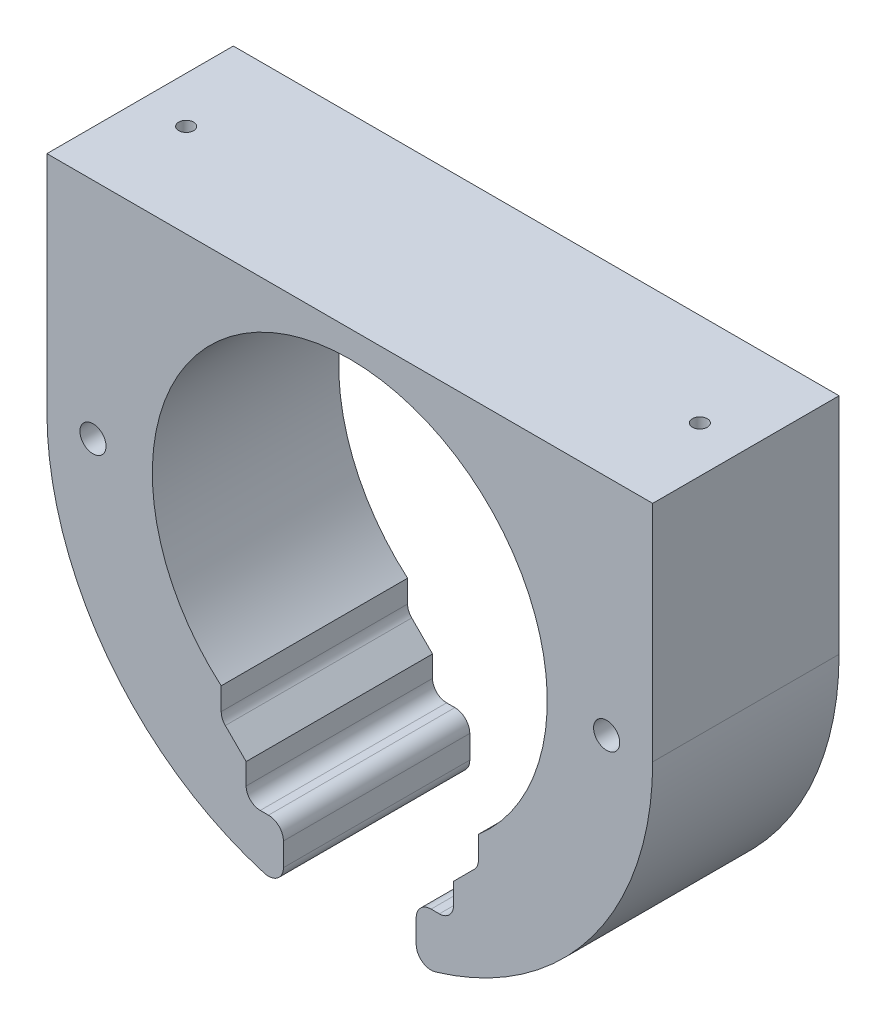
ISO-10303-21;
HEADER;
FILE_DESCRIPTION(('STEP AP214'),'2;1');
FILE_NAME('part.step','',(''),(''),'','','');
FILE_SCHEMA(('AUTOMOTIVE_DESIGN { 1 0 10303 214 1 1 1 1 }'));
ENDSEC;
DATA;
#1=APPLICATION_CONTEXT('core data for automotive mechanical design processes');
#2=APPLICATION_PROTOCOL_DEFINITION('international standard','automotive_design',2000,#1);
#3=PRODUCT_CONTEXT('',#1,'mechanical');
#4=PRODUCT('Part','Part','',(#3));
#5=PRODUCT_RELATED_PRODUCT_CATEGORY('part','',(#4));
#6=PRODUCT_DEFINITION_FORMATION('','',#4);
#7=PRODUCT_DEFINITION_CONTEXT('part definition',#1,'design');
#8=PRODUCT_DEFINITION('design','',#6,#7);
#9=PRODUCT_DEFINITION_SHAPE('','',#8);
#10=(LENGTH_UNIT() NAMED_UNIT(*) SI_UNIT(.MILLI.,.METRE.));
#11=(NAMED_UNIT(*) PLANE_ANGLE_UNIT() SI_UNIT($,.RADIAN.));
#12=(NAMED_UNIT(*) SI_UNIT($,.STERADIAN.) SOLID_ANGLE_UNIT());
#13=UNCERTAINTY_MEASURE_WITH_UNIT(LENGTH_MEASURE(1.E-05),#10,'distance_accuracy_value','');
#14=(GEOMETRIC_REPRESENTATION_CONTEXT(3) GLOBAL_UNCERTAINTY_ASSIGNED_CONTEXT((#13)) GLOBAL_UNIT_ASSIGNED_CONTEXT((#10,
#11,#12)) REPRESENTATION_CONTEXT('',''));
#15=CARTESIAN_POINT('',(0.,0.,0.));
#16=DIRECTION('',(0.,0.,1.));
#17=DIRECTION('',(1.,0.,0.));
#18=AXIS2_PLACEMENT_3D('',#15,#16,#17);
#19=CARTESIAN_POINT('',(7.80176695441169,-19.422942901138,12.7));
#20=DIRECTION('',(0.,0.,1.));
#21=DIRECTION('',(1.,0.,0.));
#22=AXIS2_PLACEMENT_3D('',#19,#20,#21);
#23=PLANE('',#22);
#24=CARTESIAN_POINT('',(-17.5,-7.68858431104459,12.7));
#25=DIRECTION('',(0.,0.,1.));
#26=DIRECTION('',(1.,0.,0.));
#27=AXIS2_PLACEMENT_3D('',#24,#25,#26);
#28=CIRCLE('',#27,0.889);
#29=CARTESIAN_POINT('',(-16.611,-7.68858431104459,12.7));
#30=VERTEX_POINT('',#29);
#31=EDGE_CURVE('E229',#30,#30,#28,.T.);
#32=ORIENTED_EDGE('',*,*,#31,.F.);
#33=EDGE_LOOP('',(#32));
#34=FACE_BOUND('',#33,.T.);
#35=CARTESIAN_POINT('',(7.80176695441169,-19.422942901138,12.7));
#36=DIRECTION('',(0.,0.,-1.));
#37=DIRECTION('',(1.,0.,0.));
#38=AXIS2_PLACEMENT_3D('',#35,#36,#37);
#39=CIRCLE('',#38,0.961073038880573);
#40=CARTESIAN_POINT('',(8.76283999329226,-19.4229429011379,12.7));
#41=VERTEX_POINT('',#40);
#42=CARTESIAN_POINT('',(8.4813482174197,-20.102524164146,12.7));
#43=VERTEX_POINT('',#42);
#44=EDGE_CURVE('E272',#41,#43,#39,.T.);
#45=ORIENTED_EDGE('',*,*,#44,.T.);
#46=DIRECTION('',(-0.707106781186548,-0.707106781186547,0.));
#47=VECTOR('',#46,1.);
#48=CARTESIAN_POINT('',(7.06388683577223,-21.5199855457934,12.7));
#49=LINE('',#48,#47);
#50=CARTESIAN_POINT('',(7.06388683577223,-21.5199855457934,12.7));
#51=VERTEX_POINT('',#50);
#52=EDGE_CURVE('E139',#43,#51,#49,.T.);
#53=ORIENTED_EDGE('',*,*,#52,.T.);
#54=DIRECTION('',(0.,-1.,0.));
#55=VECTOR('',#54,1.);
#56=CARTESIAN_POINT('',(7.06388683577223,-22.9615951041143,12.7));
#57=LINE('',#56,#55);
#58=CARTESIAN_POINT('',(7.06388683577223,-22.9615951041143,12.7));
#59=VERTEX_POINT('',#58);
#60=EDGE_CURVE('E335',#51,#59,#57,.T.);
#61=ORIENTED_EDGE('',*,*,#60,.T.);
#62=CARTESIAN_POINT('',(6.10281379689165,-22.9615951041143,12.7));
#63=DIRECTION('',(0.,0.,-1.));
#64=DIRECTION('',(1.,0.,0.));
#65=AXIS2_PLACEMENT_3D('',#62,#63,#64);
#66=CIRCLE('',#65,0.961073038880575);
#67=CARTESIAN_POINT('',(6.10281379689165,-23.9226681429949,12.7));
#68=VERTEX_POINT('',#67);
#69=EDGE_CURVE('E354',#59,#68,#66,.T.);
#70=ORIENTED_EDGE('',*,*,#69,.T.);
#71=DIRECTION('',(-1.,0.,0.));
#72=VECTOR('',#71,1.);
#73=CARTESIAN_POINT('',(5.53988683577223,-23.9226681429949,12.7));
#74=LINE('',#73,#72);
#75=CARTESIAN_POINT('',(5.53988683577223,-23.9226681429949,12.7));
#76=VERTEX_POINT('',#75);
#77=EDGE_CURVE('E351',#68,#76,#74,.T.);
#78=ORIENTED_EDGE('',*,*,#77,.T.);
#79=CARTESIAN_POINT('',(5.53988683577223,-24.9386681429949,12.7));
#80=DIRECTION('',(0.,0.,1.));
#81=DIRECTION('',(1.,0.,0.));
#82=AXIS2_PLACEMENT_3D('',#79,#80,#81);
#83=CIRCLE('',#82,1.016);
#84=CARTESIAN_POINT('',(4.52388683577223,-24.9386681429949,12.7));
#85=VERTEX_POINT('',#84);
#86=EDGE_CURVE('E353',#76,#85,#83,.T.);
#87=ORIENTED_EDGE('',*,*,#86,.T.);
#88=DIRECTION('',(0.,-1.,0.));
#89=VECTOR('',#88,1.);
#90=CARTESIAN_POINT('',(4.52388683577223,-26.5117858478937,12.7));
#91=LINE('',#90,#89);
#92=CARTESIAN_POINT('',(4.52388683577223,-26.5117858478937,12.7));
#93=VERTEX_POINT('',#92);
#94=EDGE_CURVE('E356',#85,#93,#91,.T.);
#95=ORIENTED_EDGE('',*,*,#94,.T.);
#96=CARTESIAN_POINT('',(5.53988683577223,-26.5117858478937,12.7));
#97=DIRECTION('',(0.,0.,1.));
#98=DIRECTION('',(-1.,0.,0.));
#99=AXIS2_PLACEMENT_3D('',#96,#97,#98);
#100=CIRCLE('',#99,1.016);
#101=CARTESIAN_POINT('',(5.82674181755978,-27.4864500051415,12.7));
#102=VERTEX_POINT('',#101);
#103=EDGE_CURVE('E362',#93,#102,#100,.T.);
#104=ORIENTED_EDGE('',*,*,#103,.T.);
#105=CARTESIAN_POINT('',(0.,-7.68858431104459,12.7));
#106=DIRECTION('',(0.,0.,1.));
#107=DIRECTION('',(1.,0.,0.));
#108=AXIS2_PLACEMENT_3D('',#105,#106,#107);
#109=CIRCLE('',#108,20.6375);
#110=CARTESIAN_POINT('',(20.6375,-7.68858431104459,12.7));
#111=VERTEX_POINT('',#110);
#112=EDGE_CURVE('E364',#102,#111,#109,.T.);
#113=ORIENTED_EDGE('',*,*,#112,.T.);
#114=DIRECTION('',(0.,1.,0.));
#115=VECTOR('',#114,1.);
#116=CARTESIAN_POINT('',(20.6375,7.5672668129554,12.7));
#117=LINE('',#116,#115);
#118=CARTESIAN_POINT('',(20.6375,7.5672668129554,12.7));
#119=VERTEX_POINT('',#118);
#120=EDGE_CURVE('E366',#111,#119,#117,.T.);
#121=ORIENTED_EDGE('',*,*,#120,.T.);
#122=DIRECTION('',(-1.,0.,0.));
#123=VECTOR('',#122,1.);
#124=CARTESIAN_POINT('',(-20.6375,7.5672668129554,12.7));
#125=LINE('',#124,#123);
#126=CARTESIAN_POINT('',(-20.6375,7.5672668129554,12.7));
#127=VERTEX_POINT('',#126);
#128=EDGE_CURVE('E368',#119,#127,#125,.T.);
#129=ORIENTED_EDGE('',*,*,#128,.T.);
#130=DIRECTION('',(0.,-1.,0.));
#131=VECTOR('',#130,1.);
#132=CARTESIAN_POINT('',(-20.6375,-7.68858431104459,12.7));
#133=LINE('',#132,#131);
#134=CARTESIAN_POINT('',(-20.6375,-7.68858431104459,12.7));
#135=VERTEX_POINT('',#134);
#136=EDGE_CURVE('E370',#127,#135,#133,.T.);
#137=ORIENTED_EDGE('',*,*,#136,.T.);
#138=CARTESIAN_POINT('',(0.,-7.68858431104459,12.7));
#139=DIRECTION('',(0.,0.,1.));
#140=DIRECTION('',(1.,0.,0.));
#141=AXIS2_PLACEMENT_3D('',#138,#139,#140);
#142=CIRCLE('',#141,20.6375);
#143=CARTESIAN_POINT('',(-5.82674181755977,-27.4864500051415,12.7));
#144=VERTEX_POINT('',#143);
#145=EDGE_CURVE('E372',#135,#144,#142,.T.);
#146=ORIENTED_EDGE('',*,*,#145,.T.);
#147=CARTESIAN_POINT('',(-5.53988683577221,-26.5117858478937,12.7));
#148=DIRECTION('',(0.,0.,1.));
#149=DIRECTION('',(1.,0.,0.));
#150=AXIS2_PLACEMENT_3D('',#147,#148,#149);
#151=CIRCLE('',#150,1.016);
#152=CARTESIAN_POINT('',(-4.52388683577221,-26.5117858478937,12.7));
#153=VERTEX_POINT('',#152);
#154=EDGE_CURVE('E374',#144,#153,#151,.T.);
#155=ORIENTED_EDGE('',*,*,#154,.T.);
#156=DIRECTION('',(0.,1.,0.));
#157=VECTOR('',#156,1.);
#158=CARTESIAN_POINT('',(-4.52388683577221,-24.9386681429949,12.7));
#159=LINE('',#158,#157);
#160=CARTESIAN_POINT('',(-4.52388683577221,-24.9386681429949,12.7));
#161=VERTEX_POINT('',#160);
#162=EDGE_CURVE('E376',#153,#161,#159,.T.);
#163=ORIENTED_EDGE('',*,*,#162,.T.);
#164=CARTESIAN_POINT('',(-5.53988683577221,-24.9386681429949,12.7));
#165=DIRECTION('',(0.,0.,1.));
#166=DIRECTION('',(-1.,0.,0.));
#167=AXIS2_PLACEMENT_3D('',#164,#165,#166);
#168=CIRCLE('',#167,1.016);
#169=CARTESIAN_POINT('',(-5.53988683577222,-23.9226681429949,12.7));
#170=VERTEX_POINT('',#169);
#171=EDGE_CURVE('E378',#161,#170,#168,.T.);
#172=ORIENTED_EDGE('',*,*,#171,.T.);
#173=DIRECTION('',(-1.,0.,0.));
#174=VECTOR('',#173,1.);
#175=CARTESIAN_POINT('',(-6.10281379689163,-23.9226681429949,12.7));
#176=LINE('',#175,#174);
#177=CARTESIAN_POINT('',(-6.10281379689163,-23.9226681429949,12.7));
#178=VERTEX_POINT('',#177);
#179=EDGE_CURVE('E380',#170,#178,#176,.T.);
#180=ORIENTED_EDGE('',*,*,#179,.T.);
#181=CARTESIAN_POINT('',(-6.10281379689164,-22.9615951041143,12.7));
#182=DIRECTION('',(0.,0.,-1.));
#183=DIRECTION('',(1.,0.,0.));
#184=AXIS2_PLACEMENT_3D('',#181,#182,#183);
#185=CIRCLE('',#184,0.961073038880575);
#186=CARTESIAN_POINT('',(-7.06388683577221,-22.9615951041143,12.7));
#187=VERTEX_POINT('',#186);
#188=EDGE_CURVE('E382',#178,#187,#185,.T.);
#189=ORIENTED_EDGE('',*,*,#188,.T.);
#190=DIRECTION('',(0.,1.,0.));
#191=VECTOR('',#190,1.);
#192=CARTESIAN_POINT('',(-7.06388683577221,-21.5199855457934,12.7));
#193=LINE('',#192,#191);
#194=CARTESIAN_POINT('',(-7.06388683577221,-21.5199855457934,12.7));
#195=VERTEX_POINT('',#194);
#196=EDGE_CURVE('E384',#187,#195,#193,.T.);
#197=ORIENTED_EDGE('',*,*,#196,.T.);
#198=DIRECTION('',(-0.707106781186549,0.707106781186546,0.));
#199=VECTOR('',#198,1.);
#200=CARTESIAN_POINT('',(-8.48134821741969,-20.102524164146,12.7));
#201=LINE('',#200,#199);
#202=CARTESIAN_POINT('',(-8.48134821741969,-20.102524164146,12.7));
#203=VERTEX_POINT('',#202);
#204=EDGE_CURVE('E386',#195,#203,#201,.T.);
#205=ORIENTED_EDGE('',*,*,#204,.T.);
#206=CARTESIAN_POINT('',(-7.80176695441168,-19.422942901138,12.7));
#207=DIRECTION('',(0.,0.,-1.));
#208=DIRECTION('',(1.,0.,0.));
#209=AXIS2_PLACEMENT_3D('',#206,#207,#208);
#210=CIRCLE('',#209,0.961073038880575);
#211=CARTESIAN_POINT('',(-8.76283999329225,-19.422942901138,12.7));
#212=VERTEX_POINT('',#211);
#213=EDGE_CURVE('E206',#203,#212,#210,.T.);
#214=ORIENTED_EDGE('',*,*,#213,.T.);
#215=DIRECTION('',(0.,1.,0.));
#216=VECTOR('',#215,1.);
#217=CARTESIAN_POINT('',(-8.76283999329225,-17.8988863105123,12.7));
#218=LINE('',#217,#216);
#219=CARTESIAN_POINT('',(-8.76283999329225,-17.8988863105123,12.7));
#220=VERTEX_POINT('',#219);
#221=EDGE_CURVE('E200',#212,#220,#218,.T.);
#222=ORIENTED_EDGE('',*,*,#221,.T.);
#223=CARTESIAN_POINT('',(0.,-7.68858431104459,12.7));
#224=DIRECTION('',(0.,0.,-1.));
#225=DIRECTION('',(1.,0.,0.));
#226=AXIS2_PLACEMENT_3D('',#223,#224,#225);
#227=CIRCLE('',#226,13.455022544328);
#228=CARTESIAN_POINT('',(8.76283999329226,-17.8988863105123,12.7));
#229=VERTEX_POINT('',#228);
#230=EDGE_CURVE('E204',#220,#229,#227,.T.);
#231=ORIENTED_EDGE('',*,*,#230,.T.);
#232=DIRECTION('',(0.,-1.,0.));
#233=VECTOR('',#232,1.);
#234=CARTESIAN_POINT('',(8.76283999329226,-19.4229429011379,12.7));
#235=LINE('',#234,#233);
#236=EDGE_CURVE('E49',#229,#41,#235,.T.);
#237=ORIENTED_EDGE('',*,*,#236,.T.);
#238=EDGE_LOOP('',(#45,#53,#61,#70,#78,#87,#95,#104,#113,#121,#129,#137,#146,#155,#163,#172,
#180,#189,#197,#205,#214,#222,#231,#237));
#239=FACE_BOUND('',#238,.T.);
#240=CARTESIAN_POINT('',(17.5,-7.68858431104459,12.7));
#241=DIRECTION('',(0.,0.,1.));
#242=DIRECTION('',(1.,0.,0.));
#243=AXIS2_PLACEMENT_3D('',#240,#241,#242);
#244=CIRCLE('',#243,0.889);
#245=CARTESIAN_POINT('',(18.389,-7.68858431104459,12.7));
#246=VERTEX_POINT('',#245);
#247=EDGE_CURVE('E457',#246,#246,#244,.T.);
#248=ORIENTED_EDGE('',*,*,#247,.F.);
#249=EDGE_LOOP('',(#248));
#250=FACE_BOUND('',#249,.T.);
#251=ADVANCED_FACE('F32',(#34,#239,#250),#23,.T.);
#252=CARTESIAN_POINT('',(7.80176695441169,-19.422942901138,0.));
#253=DIRECTION('',(0.,0.,1.));
#254=DIRECTION('',(1.,0.,0.));
#255=AXIS2_PLACEMENT_3D('',#252,#253,#254);
#256=PLANE('',#255);
#257=CARTESIAN_POINT('',(-17.5,-7.68858431104459,0.));
#258=DIRECTION('',(0.,0.,1.));
#259=DIRECTION('',(1.,0.,0.));
#260=AXIS2_PLACEMENT_3D('',#257,#258,#259);
#261=CIRCLE('',#260,0.889);
#262=CARTESIAN_POINT('',(-16.611,-7.68858431104459,0.));
#263=VERTEX_POINT('',#262);
#264=EDGE_CURVE('E460',#263,#263,#261,.T.);
#265=ORIENTED_EDGE('',*,*,#264,.T.);
#266=EDGE_LOOP('',(#265));
#267=FACE_BOUND('',#266,.T.);
#268=CARTESIAN_POINT('',(7.80176695441169,-19.422942901138,0.));
#269=DIRECTION('',(0.,0.,-1.));
#270=DIRECTION('',(1.,0.,0.));
#271=AXIS2_PLACEMENT_3D('',#268,#269,#270);
#272=CIRCLE('',#271,0.961073038880573);
#273=CARTESIAN_POINT('',(8.76283999329226,-19.4229429011379,0.));
#274=VERTEX_POINT('',#273);
#275=CARTESIAN_POINT('',(8.4813482174197,-20.102524164146,0.));
#276=VERTEX_POINT('',#275);
#277=EDGE_CURVE('E225',#274,#276,#272,.T.);
#278=ORIENTED_EDGE('',*,*,#277,.F.);
#279=DIRECTION('',(0.,-1.,0.));
#280=VECTOR('',#279,1.);
#281=CARTESIAN_POINT('',(8.76283999329226,-19.4229429011379,0.));
#282=LINE('',#281,#280);
#283=CARTESIAN_POINT('',(8.76283999329226,-17.8988863105123,0.));
#284=VERTEX_POINT('',#283);
#285=EDGE_CURVE('E131',#284,#274,#282,.T.);
#286=ORIENTED_EDGE('',*,*,#285,.F.);
#287=CARTESIAN_POINT('',(0.,-7.68858431104459,0.));
#288=DIRECTION('',(0.,0.,-1.));
#289=DIRECTION('',(1.,0.,0.));
#290=AXIS2_PLACEMENT_3D('',#287,#288,#289);
#291=CIRCLE('',#290,13.455022544328);
#292=CARTESIAN_POINT('',(-8.76283999329225,-17.8988863105123,0.));
#293=VERTEX_POINT('',#292);
#294=EDGE_CURVE('E125',#293,#284,#291,.T.);
#295=ORIENTED_EDGE('',*,*,#294,.F.);
#296=DIRECTION('',(0.,1.,0.));
#297=VECTOR('',#296,1.);
#298=CARTESIAN_POINT('',(-8.76283999329225,-17.8988863105123,0.));
#299=LINE('',#298,#297);
#300=CARTESIAN_POINT('',(-8.76283999329225,-19.422942901138,0.));
#301=VERTEX_POINT('',#300);
#302=EDGE_CURVE('E215',#301,#293,#299,.T.);
#303=ORIENTED_EDGE('',*,*,#302,.F.);
#304=CARTESIAN_POINT('',(-7.80176695441168,-19.422942901138,0.));
#305=DIRECTION('',(0.,0.,-1.));
#306=DIRECTION('',(1.,0.,0.));
#307=AXIS2_PLACEMENT_3D('',#304,#305,#306);
#308=CIRCLE('',#307,0.961073038880575);
#309=CARTESIAN_POINT('',(-8.48134821741969,-20.102524164146,0.));
#310=VERTEX_POINT('',#309);
#311=EDGE_CURVE('E267',#310,#301,#308,.T.);
#312=ORIENTED_EDGE('',*,*,#311,.F.);
#313=DIRECTION('',(-0.707106781186549,0.707106781186546,0.));
#314=VECTOR('',#313,1.);
#315=CARTESIAN_POINT('',(-8.48134821741969,-20.102524164146,0.));
#316=LINE('',#315,#314);
#317=CARTESIAN_POINT('',(-7.06388683577221,-21.5199855457934,0.));
#318=VERTEX_POINT('',#317);
#319=EDGE_CURVE('E265',#318,#310,#316,.T.);
#320=ORIENTED_EDGE('',*,*,#319,.F.);
#321=DIRECTION('',(0.,1.,0.));
#322=VECTOR('',#321,1.);
#323=CARTESIAN_POINT('',(-7.06388683577221,-21.5199855457934,0.));
#324=LINE('',#323,#322);
#325=CARTESIAN_POINT('',(-7.06388683577221,-22.9615951041143,0.));
#326=VERTEX_POINT('',#325);
#327=EDGE_CURVE('E263',#326,#318,#324,.T.);
#328=ORIENTED_EDGE('',*,*,#327,.F.);
#329=CARTESIAN_POINT('',(-6.10281379689164,-22.9615951041143,0.));
#330=DIRECTION('',(0.,0.,-1.));
#331=DIRECTION('',(1.,0.,0.));
#332=AXIS2_PLACEMENT_3D('',#329,#330,#331);
#333=CIRCLE('',#332,0.961073038880575);
#334=CARTESIAN_POINT('',(-6.10281379689163,-23.9226681429949,0.));
#335=VERTEX_POINT('',#334);
#336=EDGE_CURVE('E261',#335,#326,#333,.T.);
#337=ORIENTED_EDGE('',*,*,#336,.F.);
#338=DIRECTION('',(-1.,0.,0.));
#339=VECTOR('',#338,1.);
#340=CARTESIAN_POINT('',(-6.10281379689163,-23.9226681429949,0.));
#341=LINE('',#340,#339);
#342=CARTESIAN_POINT('',(-5.53988683577222,-23.9226681429949,0.));
#343=VERTEX_POINT('',#342);
#344=EDGE_CURVE('E259',#343,#335,#341,.T.);
#345=ORIENTED_EDGE('',*,*,#344,.F.);
#346=CARTESIAN_POINT('',(-5.53988683577221,-24.9386681429949,0.));
#347=DIRECTION('',(0.,0.,1.));
#348=DIRECTION('',(-1.,0.,0.));
#349=AXIS2_PLACEMENT_3D('',#346,#347,#348);
#350=CIRCLE('',#349,1.016);
#351=CARTESIAN_POINT('',(-4.52388683577221,-24.9386681429949,0.));
#352=VERTEX_POINT('',#351);
#353=EDGE_CURVE('E257',#352,#343,#350,.T.);
#354=ORIENTED_EDGE('',*,*,#353,.F.);
#355=DIRECTION('',(0.,1.,0.));
#356=VECTOR('',#355,1.);
#357=CARTESIAN_POINT('',(-4.52388683577221,-24.9386681429949,0.));
#358=LINE('',#357,#356);
#359=CARTESIAN_POINT('',(-4.52388683577221,-26.5117858478937,0.));
#360=VERTEX_POINT('',#359);
#361=EDGE_CURVE('E255',#360,#352,#358,.T.);
#362=ORIENTED_EDGE('',*,*,#361,.F.);
#363=CARTESIAN_POINT('',(-5.53988683577221,-26.5117858478937,0.));
#364=DIRECTION('',(0.,0.,1.));
#365=DIRECTION('',(1.,0.,0.));
#366=AXIS2_PLACEMENT_3D('',#363,#364,#365);
#367=CIRCLE('',#366,1.016);
#368=CARTESIAN_POINT('',(-5.82674181755977,-27.4864500051415,0.));
#369=VERTEX_POINT('',#368);
#370=EDGE_CURVE('E253',#369,#360,#367,.T.);
#371=ORIENTED_EDGE('',*,*,#370,.F.);
#372=CARTESIAN_POINT('',(0.,-7.68858431104459,0.));
#373=DIRECTION('',(0.,0.,1.));
#374=DIRECTION('',(1.,0.,0.));
#375=AXIS2_PLACEMENT_3D('',#372,#373,#374);
#376=CIRCLE('',#375,20.6375);
#377=CARTESIAN_POINT('',(-20.6375,-7.68858431104459,0.));
#378=VERTEX_POINT('',#377);
#379=EDGE_CURVE('E251',#378,#369,#376,.T.);
#380=ORIENTED_EDGE('',*,*,#379,.F.);
#381=DIRECTION('',(0.,-1.,0.));
#382=VECTOR('',#381,1.);
#383=CARTESIAN_POINT('',(-20.6375,-7.68858431104459,0.));
#384=LINE('',#383,#382);
#385=CARTESIAN_POINT('',(-20.6375,7.5672668129554,0.));
#386=VERTEX_POINT('',#385);
#387=EDGE_CURVE('E249',#386,#378,#384,.T.);
#388=ORIENTED_EDGE('',*,*,#387,.F.);
#389=DIRECTION('',(-1.,0.,0.));
#390=VECTOR('',#389,1.);
#391=CARTESIAN_POINT('',(-20.6375,7.5672668129554,0.));
#392=LINE('',#391,#390);
#393=CARTESIAN_POINT('',(20.6375,7.5672668129554,0.));
#394=VERTEX_POINT('',#393);
#395=EDGE_CURVE('E247',#394,#386,#392,.T.);
#396=ORIENTED_EDGE('',*,*,#395,.F.);
#397=DIRECTION('',(0.,1.,0.));
#398=VECTOR('',#397,1.);
#399=CARTESIAN_POINT('',(20.6375,7.5672668129554,0.));
#400=LINE('',#399,#398);
#401=CARTESIAN_POINT('',(20.6375,-7.68858431104459,0.));
#402=VERTEX_POINT('',#401);
#403=EDGE_CURVE('E245',#402,#394,#400,.T.);
#404=ORIENTED_EDGE('',*,*,#403,.F.);
#405=CARTESIAN_POINT('',(0.,-7.68858431104459,0.));
#406=DIRECTION('',(0.,0.,1.));
#407=DIRECTION('',(1.,0.,0.));
#408=AXIS2_PLACEMENT_3D('',#405,#406,#407);
#409=CIRCLE('',#408,20.6375);
#410=CARTESIAN_POINT('',(5.82674181755978,-27.4864500051415,0.));
#411=VERTEX_POINT('',#410);
#412=EDGE_CURVE('E243',#411,#402,#409,.T.);
#413=ORIENTED_EDGE('',*,*,#412,.F.);
#414=CARTESIAN_POINT('',(5.53988683577223,-26.5117858478937,0.));
#415=DIRECTION('',(0.,0.,1.));
#416=DIRECTION('',(-1.,0.,0.));
#417=AXIS2_PLACEMENT_3D('',#414,#415,#416);
#418=CIRCLE('',#417,1.016);
#419=CARTESIAN_POINT('',(4.52388683577223,-26.5117858478937,0.));
#420=VERTEX_POINT('',#419);
#421=EDGE_CURVE('E241',#420,#411,#418,.T.);
#422=ORIENTED_EDGE('',*,*,#421,.F.);
#423=DIRECTION('',(0.,-1.,0.));
#424=VECTOR('',#423,1.);
#425=CARTESIAN_POINT('',(4.52388683577223,-26.5117858478937,0.));
#426=LINE('',#425,#424);
#427=CARTESIAN_POINT('',(4.52388683577223,-24.9386681429949,0.));
#428=VERTEX_POINT('',#427);
#429=EDGE_CURVE('E239',#428,#420,#426,.T.);
#430=ORIENTED_EDGE('',*,*,#429,.F.);
#431=CARTESIAN_POINT('',(5.53988683577223,-24.9386681429949,0.));
#432=DIRECTION('',(0.,0.,1.));
#433=DIRECTION('',(1.,0.,0.));
#434=AXIS2_PLACEMENT_3D('',#431,#432,#433);
#435=CIRCLE('',#434,1.016);
#436=CARTESIAN_POINT('',(5.53988683577223,-23.9226681429949,0.));
#437=VERTEX_POINT('',#436);
#438=EDGE_CURVE('E237',#437,#428,#435,.T.);
#439=ORIENTED_EDGE('',*,*,#438,.F.);
#440=DIRECTION('',(-1.,0.,0.));
#441=VECTOR('',#440,1.);
#442=CARTESIAN_POINT('',(5.53988683577223,-23.9226681429949,0.));
#443=LINE('',#442,#441);
#444=CARTESIAN_POINT('',(6.10281379689165,-23.9226681429949,0.));
#445=VERTEX_POINT('',#444);
#446=EDGE_CURVE('E235',#445,#437,#443,.T.);
#447=ORIENTED_EDGE('',*,*,#446,.F.);
#448=CARTESIAN_POINT('',(6.10281379689165,-22.9615951041143,0.));
#449=DIRECTION('',(0.,0.,-1.));
#450=DIRECTION('',(1.,0.,0.));
#451=AXIS2_PLACEMENT_3D('',#448,#449,#450);
#452=CIRCLE('',#451,0.961073038880575);
#453=CARTESIAN_POINT('',(7.06388683577223,-22.9615951041143,0.));
#454=VERTEX_POINT('',#453);
#455=EDGE_CURVE('E233',#454,#445,#452,.T.);
#456=ORIENTED_EDGE('',*,*,#455,.F.);
#457=DIRECTION('',(0.,-1.,0.));
#458=VECTOR('',#457,1.);
#459=CARTESIAN_POINT('',(7.06388683577223,-22.9615951041143,0.));
#460=LINE('',#459,#458);
#461=CARTESIAN_POINT('',(7.06388683577223,-21.5199855457934,0.));
#462=VERTEX_POINT('',#461);
#463=EDGE_CURVE('E231',#462,#454,#460,.T.);
#464=ORIENTED_EDGE('',*,*,#463,.F.);
#465=DIRECTION('',(-0.707106781186548,-0.707106781186547,0.));
#466=VECTOR('',#465,1.);
#467=CARTESIAN_POINT('',(7.06388683577223,-21.5199855457934,0.));
#468=LINE('',#467,#466);
#469=EDGE_CURVE('E228',#276,#462,#468,.T.);
#470=ORIENTED_EDGE('',*,*,#469,.F.);
#471=EDGE_LOOP('',(#278,#286,#295,#303,#312,#320,#328,#337,#345,#354,#362,#371,#380,#388,#396,
#404,#413,#422,#430,#439,#447,#456,#464,#470));
#472=FACE_BOUND('',#471,.T.);
#473=CARTESIAN_POINT('',(17.5,-7.68858431104459,0.));
#474=DIRECTION('',(0.,0.,1.));
#475=DIRECTION('',(1.,0.,0.));
#476=AXIS2_PLACEMENT_3D('',#473,#474,#475);
#477=CIRCLE('',#476,0.889);
#478=CARTESIAN_POINT('',(18.389,-7.68858431104459,0.));
#479=VERTEX_POINT('',#478);
#480=EDGE_CURVE('E455',#479,#479,#477,.T.);
#481=ORIENTED_EDGE('',*,*,#480,.T.);
#482=EDGE_LOOP('',(#481));
#483=FACE_BOUND('',#482,.T.);
#484=ADVANCED_FACE('F339',(#267,#472,#483),#256,.F.);
#485=CARTESIAN_POINT('',(7.80176695441169,-19.422942901138,12.7));
#486=DIRECTION('',(0.,0.,-1.));
#487=DIRECTION('',(-1.,0.,0.));
#488=AXIS2_PLACEMENT_3D('',#485,#486,#487);
#489=CYLINDRICAL_SURFACE('',#488,0.961073038880573);
#490=ORIENTED_EDGE('',*,*,#277,.T.);
#491=DIRECTION('',(0.,0.,-1.));
#492=VECTOR('',#491,1.);
#493=CARTESIAN_POINT('',(8.4813482174197,-20.102524164146,12.7));
#494=LINE('',#493,#492);
#495=EDGE_CURVE('E11',#43,#276,#494,.T.);
#496=ORIENTED_EDGE('',*,*,#495,.F.);
#497=ORIENTED_EDGE('',*,*,#44,.F.);
#498=DIRECTION('',(0.,0.,-1.));
#499=VECTOR('',#498,1.);
#500=CARTESIAN_POINT('',(8.76283999329226,-19.4229429011379,12.7));
#501=LINE('',#500,#499);
#502=EDGE_CURVE('E221',#41,#274,#501,.T.);
#503=ORIENTED_EDGE('',*,*,#502,.T.);
#504=EDGE_LOOP('',(#490,#496,#497,#503));
#505=FACE_BOUND('',#504,.T.);
#506=ADVANCED_FACE('F34',(#505),#489,.F.);
#507=CARTESIAN_POINT('',(7.06388683577223,-21.5199855457934,12.7));
#508=DIRECTION('',(0.707106781186547,-0.707106781186548,0.));
#509=DIRECTION('',(0.707106781186548,0.707106781186547,0.));
#510=AXIS2_PLACEMENT_3D('',#507,#508,#509);
#511=PLANE('',#510);
#512=ORIENTED_EDGE('',*,*,#469,.T.);
#513=DIRECTION('',(0.,0.,-1.));
#514=VECTOR('',#513,1.);
#515=CARTESIAN_POINT('',(7.06388683577223,-21.5199855457934,12.7));
#516=LINE('',#515,#514);
#517=EDGE_CURVE('E41',#51,#462,#516,.T.);
#518=ORIENTED_EDGE('',*,*,#517,.F.);
#519=ORIENTED_EDGE('',*,*,#52,.F.);
#520=ORIENTED_EDGE('',*,*,#495,.T.);
#521=EDGE_LOOP('',(#512,#518,#519,#520));
#522=FACE_BOUND('',#521,.T.);
#523=ADVANCED_FACE('F539',(#522),#511,.F.);
#524=CARTESIAN_POINT('',(7.06388683577223,-22.9615951041143,12.7));
#525=DIRECTION('',(1.,0.,0.));
#526=DIRECTION('',(0.,0.,-1.));
#527=AXIS2_PLACEMENT_3D('',#524,#525,#526);
#528=PLANE('',#527);
#529=ORIENTED_EDGE('',*,*,#463,.T.);
#530=DIRECTION('',(0.,0.,-1.));
#531=VECTOR('',#530,1.);
#532=CARTESIAN_POINT('',(7.06388683577223,-22.9615951041143,12.7));
#533=LINE('',#532,#531);
#534=EDGE_CURVE('E327',#59,#454,#533,.T.);
#535=ORIENTED_EDGE('',*,*,#534,.F.);
#536=ORIENTED_EDGE('',*,*,#60,.F.);
#537=ORIENTED_EDGE('',*,*,#517,.T.);
#538=EDGE_LOOP('',(#529,#535,#536,#537));
#539=FACE_BOUND('',#538,.T.);
#540=ADVANCED_FACE('F333',(#539),#528,.F.);
#541=CARTESIAN_POINT('',(6.10281379689165,-22.9615951041143,12.7));
#542=DIRECTION('',(0.,0.,-1.));
#543=DIRECTION('',(-1.,0.,0.));
#544=AXIS2_PLACEMENT_3D('',#541,#542,#543);
#545=CYLINDRICAL_SURFACE('',#544,0.961073038880575);
#546=ORIENTED_EDGE('',*,*,#455,.T.);
#547=DIRECTION('',(0.,0.,-1.));
#548=VECTOR('',#547,1.);
#549=CARTESIAN_POINT('',(6.10281379689165,-23.9226681429949,12.7));
#550=LINE('',#549,#548);
#551=EDGE_CURVE('E324',#68,#445,#550,.T.);
#552=ORIENTED_EDGE('',*,*,#551,.F.);
#553=ORIENTED_EDGE('',*,*,#69,.F.);
#554=ORIENTED_EDGE('',*,*,#534,.T.);
#555=EDGE_LOOP('',(#546,#552,#553,#554));
#556=FACE_BOUND('',#555,.T.);
#557=ADVANCED_FACE('F345',(#556),#545,.F.);
#558=CARTESIAN_POINT('',(5.53988683577223,-23.9226681429949,12.7));
#559=DIRECTION('',(0.,-1.,0.));
#560=DIRECTION('',(1.,0.,0.));
#561=AXIS2_PLACEMENT_3D('',#558,#559,#560);
#562=PLANE('',#561);
#563=ORIENTED_EDGE('',*,*,#446,.T.);
#564=DIRECTION('',(0.,0.,-1.));
#565=VECTOR('',#564,1.);
#566=CARTESIAN_POINT('',(5.53988683577223,-23.9226681429949,12.7));
#567=LINE('',#566,#565);
#568=EDGE_CURVE('E321',#76,#437,#567,.T.);
#569=ORIENTED_EDGE('',*,*,#568,.F.);
#570=ORIENTED_EDGE('',*,*,#77,.F.);
#571=ORIENTED_EDGE('',*,*,#551,.T.);
#572=EDGE_LOOP('',(#563,#569,#570,#571));
#573=FACE_BOUND('',#572,.T.);
#574=ADVANCED_FACE('F349',(#573),#562,.F.);
#575=CARTESIAN_POINT('',(5.53988683577223,-24.9386681429949,12.7));
#576=DIRECTION('',(0.,0.,-1.));
#577=DIRECTION('',(-1.,0.,0.));
#578=AXIS2_PLACEMENT_3D('',#575,#576,#577);
#579=CYLINDRICAL_SURFACE('',#578,1.016);
#580=ORIENTED_EDGE('',*,*,#438,.T.);
#581=DIRECTION('',(0.,0.,-1.));
#582=VECTOR('',#581,1.);
#583=CARTESIAN_POINT('',(4.52388683577223,-24.9386681429949,12.7));
#584=LINE('',#583,#582);
#585=EDGE_CURVE('E318',#85,#428,#584,.T.);
#586=ORIENTED_EDGE('',*,*,#585,.F.);
#587=ORIENTED_EDGE('',*,*,#86,.F.);
#588=ORIENTED_EDGE('',*,*,#568,.T.);
#589=EDGE_LOOP('',(#580,#586,#587,#588));
#590=FACE_BOUND('',#589,.T.);
#591=ADVANCED_FACE('F525',(#590),#579,.T.);
#592=CARTESIAN_POINT('',(4.52388683577223,-26.5117858478937,12.7));
#593=DIRECTION('',(1.,0.,0.));
#594=DIRECTION('',(0.,1.,0.));
#595=AXIS2_PLACEMENT_3D('',#592,#593,#594);
#596=PLANE('',#595);
#597=ORIENTED_EDGE('',*,*,#429,.T.);
#598=DIRECTION('',(0.,0.,-1.));
#599=VECTOR('',#598,1.);
#600=CARTESIAN_POINT('',(4.52388683577223,-26.5117858478937,12.7));
#601=LINE('',#600,#599);
#602=EDGE_CURVE('E315',#93,#420,#601,.T.);
#603=ORIENTED_EDGE('',*,*,#602,.F.);
#604=ORIENTED_EDGE('',*,*,#94,.F.);
#605=ORIENTED_EDGE('',*,*,#585,.T.);
#606=EDGE_LOOP('',(#597,#603,#604,#605));
#607=FACE_BOUND('',#606,.T.);
#608=ADVANCED_FACE('F522',(#607),#596,.F.);
#609=CARTESIAN_POINT('',(5.53988683577223,-26.5117858478937,12.7));
#610=DIRECTION('',(0.,0.,-1.));
#611=DIRECTION('',(-1.,0.,0.));
#612=AXIS2_PLACEMENT_3D('',#609,#610,#611);
#613=CYLINDRICAL_SURFACE('',#612,1.016);
#614=ORIENTED_EDGE('',*,*,#421,.T.);
#615=DIRECTION('',(0.,0.,-1.));
#616=VECTOR('',#615,1.);
#617=CARTESIAN_POINT('',(5.82674181755978,-27.4864500051415,12.7));
#618=LINE('',#617,#616);
#619=EDGE_CURVE('E312',#102,#411,#618,.T.);
#620=ORIENTED_EDGE('',*,*,#619,.F.);
#621=ORIENTED_EDGE('',*,*,#103,.F.);
#622=ORIENTED_EDGE('',*,*,#602,.T.);
#623=EDGE_LOOP('',(#614,#620,#621,#622));
#624=FACE_BOUND('',#623,.T.);
#625=ADVANCED_FACE('F518',(#624),#613,.T.);
#626=CARTESIAN_POINT('',(0.,-7.68858431104459,12.7));
#627=DIRECTION('',(0.,0.,-1.));
#628=DIRECTION('',(-1.,0.,0.));
#629=AXIS2_PLACEMENT_3D('',#626,#627,#628);
#630=CYLINDRICAL_SURFACE('',#629,20.6375);
#631=ORIENTED_EDGE('',*,*,#412,.T.);
#632=DIRECTION('',(0.,0.,-1.));
#633=VECTOR('',#632,1.);
#634=CARTESIAN_POINT('',(20.6375,-7.68858431104459,12.7));
#635=LINE('',#634,#633);
#636=EDGE_CURVE('E309',#111,#402,#635,.T.);
#637=ORIENTED_EDGE('',*,*,#636,.F.);
#638=ORIENTED_EDGE('',*,*,#112,.F.);
#639=ORIENTED_EDGE('',*,*,#619,.T.);
#640=EDGE_LOOP('',(#631,#637,#638,#639));
#641=FACE_BOUND('',#640,.T.);
#642=ADVANCED_FACE('F514',(#641),#630,.T.);
#643=CARTESIAN_POINT('',(20.6375,7.5672668129554,12.7));
#644=DIRECTION('',(-1.,0.,0.));
#645=DIRECTION('',(0.,0.,1.));
#646=AXIS2_PLACEMENT_3D('',#643,#644,#645);
#647=PLANE('',#646);
#648=ORIENTED_EDGE('',*,*,#403,.T.);
#649=DIRECTION('',(0.,0.,-1.));
#650=VECTOR('',#649,1.);
#651=CARTESIAN_POINT('',(20.6375,7.5672668129554,12.7));
#652=LINE('',#651,#650);
#653=EDGE_CURVE('E306',#119,#394,#652,.T.);
#654=ORIENTED_EDGE('',*,*,#653,.F.);
#655=ORIENTED_EDGE('',*,*,#120,.F.);
#656=ORIENTED_EDGE('',*,*,#636,.T.);
#657=EDGE_LOOP('',(#648,#654,#655,#656));
#658=FACE_BOUND('',#657,.T.);
#659=ADVANCED_FACE('F481',(#658),#647,.F.);
#660=CARTESIAN_POINT('',(-20.6375,7.5672668129554,12.7));
#661=DIRECTION('',(0.,-1.,0.));
#662=DIRECTION('',(0.,0.,-1.));
#663=AXIS2_PLACEMENT_3D('',#660,#661,#662);
#664=PLANE('',#663);
#665=CARTESIAN_POINT('',(17.5,7.5672668129554,6.35));
#666=DIRECTION('',(0.,1.,0.));
#667=DIRECTION('',(0.,0.,1.));
#668=AXIS2_PLACEMENT_3D('',#665,#666,#667);
#669=CIRCLE('',#668,0.508000000000002);
#670=CARTESIAN_POINT('',(17.5,7.5672668129554,6.858));
#671=VERTEX_POINT('',#670);
#672=EDGE_CURVE('E446',#671,#671,#669,.T.);
#673=ORIENTED_EDGE('',*,*,#672,.F.);
#674=EDGE_LOOP('',(#673));
#675=FACE_BOUND('',#674,.T.);
#676=CARTESIAN_POINT('',(-17.5,7.5672668129554,6.35));
#677=DIRECTION('',(0.,1.,0.));
#678=DIRECTION('',(0.,0.,1.));
#679=AXIS2_PLACEMENT_3D('',#676,#677,#678);
#680=CIRCLE('',#679,0.508000000000002);
#681=CARTESIAN_POINT('',(-17.5,7.5672668129554,6.858));
#682=VERTEX_POINT('',#681);
#683=EDGE_CURVE('E445',#682,#682,#680,.T.);
#684=ORIENTED_EDGE('',*,*,#683,.F.);
#685=EDGE_LOOP('',(#684));
#686=FACE_BOUND('',#685,.T.);
#687=ORIENTED_EDGE('',*,*,#395,.T.);
#688=DIRECTION('',(0.,0.,-1.));
#689=VECTOR('',#688,1.);
#690=CARTESIAN_POINT('',(-20.6375,7.5672668129554,12.7));
#691=LINE('',#690,#689);
#692=EDGE_CURVE('E303',#127,#386,#691,.T.);
#693=ORIENTED_EDGE('',*,*,#692,.F.);
#694=ORIENTED_EDGE('',*,*,#128,.F.);
#695=ORIENTED_EDGE('',*,*,#653,.T.);
#696=EDGE_LOOP('',(#687,#693,#694,#695));
#697=FACE_BOUND('',#696,.T.);
#698=ADVANCED_FACE('F477',(#675,#686,#697),#664,.F.);
#699=CARTESIAN_POINT('',(-20.6375,-7.68858431104459,12.7));
#700=DIRECTION('',(1.,0.,0.));
#701=DIRECTION('',(0.,1.,0.));
#702=AXIS2_PLACEMENT_3D('',#699,#700,#701);
#703=PLANE('',#702);
#704=ORIENTED_EDGE('',*,*,#387,.T.);
#705=DIRECTION('',(0.,0.,-1.));
#706=VECTOR('',#705,1.);
#707=CARTESIAN_POINT('',(-20.6375,-7.68858431104459,12.7));
#708=LINE('',#707,#706);
#709=EDGE_CURVE('E300',#135,#378,#708,.T.);
#710=ORIENTED_EDGE('',*,*,#709,.F.);
#711=ORIENTED_EDGE('',*,*,#136,.F.);
#712=ORIENTED_EDGE('',*,*,#692,.T.);
#713=EDGE_LOOP('',(#704,#710,#711,#712));
#714=FACE_BOUND('',#713,.T.);
#715=ADVANCED_FACE('F480',(#714),#703,.F.);
#716=CARTESIAN_POINT('',(0.,-7.68858431104459,12.7));
#717=DIRECTION('',(0.,0.,-1.));
#718=DIRECTION('',(-1.,0.,0.));
#719=AXIS2_PLACEMENT_3D('',#716,#717,#718);
#720=CYLINDRICAL_SURFACE('',#719,20.6375);
#721=ORIENTED_EDGE('',*,*,#379,.T.);
#722=DIRECTION('',(0.,0.,-1.));
#723=VECTOR('',#722,1.);
#724=CARTESIAN_POINT('',(-5.82674181755977,-27.4864500051415,12.7));
#725=LINE('',#724,#723);
#726=EDGE_CURVE('E297',#144,#369,#725,.T.);
#727=ORIENTED_EDGE('',*,*,#726,.F.);
#728=ORIENTED_EDGE('',*,*,#145,.F.);
#729=ORIENTED_EDGE('',*,*,#709,.T.);
#730=EDGE_LOOP('',(#721,#727,#728,#729));
#731=FACE_BOUND('',#730,.T.);
#732=ADVANCED_FACE('F498',(#731),#720,.T.);
#733=CARTESIAN_POINT('',(-5.53988683577221,-26.5117858478937,12.7));
#734=DIRECTION('',(0.,0.,-1.));
#735=DIRECTION('',(-1.,0.,0.));
#736=AXIS2_PLACEMENT_3D('',#733,#734,#735);
#737=CYLINDRICAL_SURFACE('',#736,1.016);
#738=ORIENTED_EDGE('',*,*,#370,.T.);
#739=DIRECTION('',(0.,0.,-1.));
#740=VECTOR('',#739,1.);
#741=CARTESIAN_POINT('',(-4.52388683577221,-26.5117858478937,12.7));
#742=LINE('',#741,#740);
#743=EDGE_CURVE('E294',#153,#360,#742,.T.);
#744=ORIENTED_EDGE('',*,*,#743,.F.);
#745=ORIENTED_EDGE('',*,*,#154,.F.);
#746=ORIENTED_EDGE('',*,*,#726,.T.);
#747=EDGE_LOOP('',(#738,#744,#745,#746));
#748=FACE_BOUND('',#747,.T.);
#749=ADVANCED_FACE('F502',(#748),#737,.T.);
#750=CARTESIAN_POINT('',(-4.52388683577221,-24.9386681429949,12.7));
#751=DIRECTION('',(-1.,0.,0.));
#752=DIRECTION('',(0.,-1.,0.));
#753=AXIS2_PLACEMENT_3D('',#750,#751,#752);
#754=PLANE('',#753);
#755=ORIENTED_EDGE('',*,*,#361,.T.);
#756=DIRECTION('',(0.,0.,-1.));
#757=VECTOR('',#756,1.);
#758=CARTESIAN_POINT('',(-4.52388683577221,-24.9386681429949,12.7));
#759=LINE('',#758,#757);
#760=EDGE_CURVE('E291',#161,#352,#759,.T.);
#761=ORIENTED_EDGE('',*,*,#760,.F.);
#762=ORIENTED_EDGE('',*,*,#162,.F.);
#763=ORIENTED_EDGE('',*,*,#743,.T.);
#764=EDGE_LOOP('',(#755,#761,#762,#763));
#765=FACE_BOUND('',#764,.T.);
#766=ADVANCED_FACE('F635',(#765),#754,.F.);
#767=CARTESIAN_POINT('',(-5.53988683577221,-24.9386681429949,12.7));
#768=DIRECTION('',(0.,0.,-1.));
#769=DIRECTION('',(-1.,0.,0.));
#770=AXIS2_PLACEMENT_3D('',#767,#768,#769);
#771=CYLINDRICAL_SURFACE('',#770,1.016);
#772=ORIENTED_EDGE('',*,*,#353,.T.);
#773=DIRECTION('',(0.,0.,-1.));
#774=VECTOR('',#773,1.);
#775=CARTESIAN_POINT('',(-5.53988683577222,-23.9226681429949,12.7));
#776=LINE('',#775,#774);
#777=EDGE_CURVE('E288',#170,#343,#776,.T.);
#778=ORIENTED_EDGE('',*,*,#777,.F.);
#779=ORIENTED_EDGE('',*,*,#171,.F.);
#780=ORIENTED_EDGE('',*,*,#760,.T.);
#781=EDGE_LOOP('',(#772,#778,#779,#780));
#782=FACE_BOUND('',#781,.T.);
#783=ADVANCED_FACE('F643',(#782),#771,.T.);
#784=CARTESIAN_POINT('',(-6.10281379689163,-23.9226681429949,12.7));
#785=DIRECTION('',(0.,-1.,0.));
#786=DIRECTION('',(0.,0.,-1.));
#787=AXIS2_PLACEMENT_3D('',#784,#785,#786);
#788=PLANE('',#787);
#789=ORIENTED_EDGE('',*,*,#344,.T.);
#790=DIRECTION('',(0.,0.,-1.));
#791=VECTOR('',#790,1.);
#792=CARTESIAN_POINT('',(-6.10281379689163,-23.9226681429949,12.7));
#793=LINE('',#792,#791);
#794=EDGE_CURVE('E285',#178,#335,#793,.T.);
#795=ORIENTED_EDGE('',*,*,#794,.F.);
#796=ORIENTED_EDGE('',*,*,#179,.F.);
#797=ORIENTED_EDGE('',*,*,#777,.T.);
#798=EDGE_LOOP('',(#789,#795,#796,#797));
#799=FACE_BOUND('',#798,.T.);
#800=ADVANCED_FACE('F652',(#799),#788,.F.);
#801=CARTESIAN_POINT('',(-6.10281379689164,-22.9615951041143,12.7));
#802=DIRECTION('',(0.,0.,-1.));
#803=DIRECTION('',(-1.,0.,0.));
#804=AXIS2_PLACEMENT_3D('',#801,#802,#803);
#805=CYLINDRICAL_SURFACE('',#804,0.961073038880575);
#806=ORIENTED_EDGE('',*,*,#336,.T.);
#807=DIRECTION('',(0.,0.,-1.));
#808=VECTOR('',#807,1.);
#809=CARTESIAN_POINT('',(-7.06388683577221,-22.9615951041143,12.7));
#810=LINE('',#809,#808);
#811=EDGE_CURVE('E282',#187,#326,#810,.T.);
#812=ORIENTED_EDGE('',*,*,#811,.F.);
#813=ORIENTED_EDGE('',*,*,#188,.F.);
#814=ORIENTED_EDGE('',*,*,#794,.T.);
#815=EDGE_LOOP('',(#806,#812,#813,#814));
#816=FACE_BOUND('',#815,.T.);
#817=ADVANCED_FACE('F661',(#816),#805,.F.);
#818=CARTESIAN_POINT('',(-7.06388683577221,-21.5199855457934,12.7));
#819=DIRECTION('',(-1.,0.,0.));
#820=DIRECTION('',(0.,0.,1.));
#821=AXIS2_PLACEMENT_3D('',#818,#819,#820);
#822=PLANE('',#821);
#823=ORIENTED_EDGE('',*,*,#327,.T.);
#824=DIRECTION('',(0.,0.,-1.));
#825=VECTOR('',#824,1.);
#826=CARTESIAN_POINT('',(-7.06388683577221,-21.5199855457934,12.7));
#827=LINE('',#826,#825);
#828=EDGE_CURVE('E279',#195,#318,#827,.T.);
#829=ORIENTED_EDGE('',*,*,#828,.F.);
#830=ORIENTED_EDGE('',*,*,#196,.F.);
#831=ORIENTED_EDGE('',*,*,#811,.T.);
#832=EDGE_LOOP('',(#823,#829,#830,#831));
#833=FACE_BOUND('',#832,.T.);
#834=ADVANCED_FACE('F670',(#833),#822,.F.);
#835=CARTESIAN_POINT('',(-8.48134821741969,-20.102524164146,12.7));
#836=DIRECTION('',(-0.707106781186546,-0.707106781186549,0.));
#837=DIRECTION('',(0.707106781186549,-0.707106781186546,0.));
#838=AXIS2_PLACEMENT_3D('',#835,#836,#837);
#839=PLANE('',#838);
#840=ORIENTED_EDGE('',*,*,#319,.T.);
#841=DIRECTION('',(0.,0.,-1.));
#842=VECTOR('',#841,1.);
#843=CARTESIAN_POINT('',(-8.48134821741969,-20.102524164146,12.7));
#844=LINE('',#843,#842);
#845=EDGE_CURVE('E276',#203,#310,#844,.T.);
#846=ORIENTED_EDGE('',*,*,#845,.F.);
#847=ORIENTED_EDGE('',*,*,#204,.F.);
#848=ORIENTED_EDGE('',*,*,#828,.T.);
#849=EDGE_LOOP('',(#840,#846,#847,#848));
#850=FACE_BOUND('',#849,.T.);
#851=ADVANCED_FACE('F392',(#850),#839,.F.);
#852=CARTESIAN_POINT('',(-7.80176695441168,-19.422942901138,12.7));
#853=DIRECTION('',(0.,0.,-1.));
#854=DIRECTION('',(-1.,0.,0.));
#855=AXIS2_PLACEMENT_3D('',#852,#853,#854);
#856=CYLINDRICAL_SURFACE('',#855,0.961073038880575);
#857=ORIENTED_EDGE('',*,*,#311,.T.);
#858=DIRECTION('',(0.,0.,-1.));
#859=VECTOR('',#858,1.);
#860=CARTESIAN_POINT('',(-8.76283999329225,-19.422942901138,12.7));
#861=LINE('',#860,#859);
#862=EDGE_CURVE('E216',#212,#301,#861,.T.);
#863=ORIENTED_EDGE('',*,*,#862,.F.);
#864=ORIENTED_EDGE('',*,*,#213,.F.);
#865=ORIENTED_EDGE('',*,*,#845,.T.);
#866=EDGE_LOOP('',(#857,#863,#864,#865));
#867=FACE_BOUND('',#866,.T.);
#868=ADVANCED_FACE('F396',(#867),#856,.F.);
#869=CARTESIAN_POINT('',(-8.76283999329225,-17.8988863105123,12.7));
#870=DIRECTION('',(-1.,0.,0.));
#871=DIRECTION('',(0.,-1.,0.));
#872=AXIS2_PLACEMENT_3D('',#869,#870,#871);
#873=PLANE('',#872);
#874=ORIENTED_EDGE('',*,*,#302,.T.);
#875=DIRECTION('',(0.,0.,-1.));
#876=VECTOR('',#875,1.);
#877=CARTESIAN_POINT('',(-8.76283999329225,-17.8988863105123,12.7));
#878=LINE('',#877,#876);
#879=EDGE_CURVE('E212',#220,#293,#878,.T.);
#880=ORIENTED_EDGE('',*,*,#879,.F.);
#881=ORIENTED_EDGE('',*,*,#221,.F.);
#882=ORIENTED_EDGE('',*,*,#862,.T.);
#883=EDGE_LOOP('',(#874,#880,#881,#882));
#884=FACE_BOUND('',#883,.T.);
#885=ADVANCED_FACE('F213',(#884),#873,.F.);
#886=CARTESIAN_POINT('',(0.,-7.68858431104459,12.7));
#887=DIRECTION('',(0.,0.,-1.));
#888=DIRECTION('',(-1.,0.,0.));
#889=AXIS2_PLACEMENT_3D('',#886,#887,#888);
#890=CYLINDRICAL_SURFACE('',#889,13.455022544328);
#891=ORIENTED_EDGE('',*,*,#294,.T.);
#892=DIRECTION('',(0.,0.,-1.));
#893=VECTOR('',#892,1.);
#894=CARTESIAN_POINT('',(8.76283999329226,-17.8988863105123,12.7));
#895=LINE('',#894,#893);
#896=EDGE_CURVE('E217',#229,#284,#895,.T.);
#897=ORIENTED_EDGE('',*,*,#896,.F.);
#898=ORIENTED_EDGE('',*,*,#230,.F.);
#899=ORIENTED_EDGE('',*,*,#879,.T.);
#900=EDGE_LOOP('',(#891,#897,#898,#899));
#901=FACE_BOUND('',#900,.T.);
#902=ADVANCED_FACE('F219',(#901),#890,.F.);
#903=CARTESIAN_POINT('',(8.76283999329226,-19.4229429011379,12.7));
#904=DIRECTION('',(1.,0.,0.));
#905=DIRECTION('',(0.,0.,-1.));
#906=AXIS2_PLACEMENT_3D('',#903,#904,#905);
#907=PLANE('',#906);
#908=ORIENTED_EDGE('',*,*,#285,.T.);
#909=ORIENTED_EDGE('',*,*,#502,.F.);
#910=ORIENTED_EDGE('',*,*,#236,.F.);
#911=ORIENTED_EDGE('',*,*,#896,.T.);
#912=EDGE_LOOP('',(#908,#909,#910,#911));
#913=FACE_BOUND('',#912,.T.);
#914=ADVANCED_FACE('F400',(#913),#907,.F.);
#915=CARTESIAN_POINT('',(-17.5,-7.68858431104459,12.7));
#916=DIRECTION('',(0.,0.,-1.));
#917=DIRECTION('',(-1.,0.,0.));
#918=AXIS2_PLACEMENT_3D('',#915,#916,#917);
#919=CYLINDRICAL_SURFACE('',#918,0.889);
#920=ORIENTED_EDGE('',*,*,#31,.T.);
#921=EDGE_LOOP('',(#920));
#922=FACE_BOUND('',#921,.T.);
#923=ORIENTED_EDGE('',*,*,#264,.F.);
#924=EDGE_LOOP('',(#923));
#925=FACE_BOUND('',#924,.T.);
#926=ADVANCED_FACE('F402',(#922,#925),#919,.F.);
#927=CARTESIAN_POINT('',(17.5,-7.68858431104459,12.7));
#928=DIRECTION('',(0.,0.,-1.));
#929=DIRECTION('',(-1.,0.,0.));
#930=AXIS2_PLACEMENT_3D('',#927,#928,#929);
#931=CYLINDRICAL_SURFACE('',#930,0.889);
#932=ORIENTED_EDGE('',*,*,#247,.T.);
#933=EDGE_LOOP('',(#932));
#934=FACE_BOUND('',#933,.T.);
#935=ORIENTED_EDGE('',*,*,#480,.F.);
#936=EDGE_LOOP('',(#935));
#937=FACE_BOUND('',#936,.T.);
#938=ADVANCED_FACE('F408',(#934,#937),#931,.F.);
#939=CARTESIAN_POINT('',(-17.5,-5.1327331870446,6.35));
#940=DIRECTION('',(0.,1.,0.));
#941=DIRECTION('',(0.,0.,1.));
#942=AXIS2_PLACEMENT_3D('',#939,#940,#941);
#943=CYLINDRICAL_SURFACE('',#942,0.508000000000002);
#944=CARTESIAN_POINT('',(-17.5,-5.1327331870446,6.35));
#945=DIRECTION('',(0.,1.,0.));
#946=DIRECTION('',(0.,0.,1.));
#947=AXIS2_PLACEMENT_3D('',#944,#945,#946);
#948=CIRCLE('',#947,0.508000000000002);
#949=CARTESIAN_POINT('',(-17.5,-5.1327331870446,6.858));
#950=VERTEX_POINT('',#949);
#951=EDGE_CURVE('E449',#950,#950,#948,.T.);
#952=ORIENTED_EDGE('',*,*,#951,.F.);
#953=EDGE_LOOP('',(#952));
#954=FACE_BOUND('',#953,.T.);
#955=ORIENTED_EDGE('',*,*,#683,.T.);
#956=EDGE_LOOP('',(#955));
#957=FACE_BOUND('',#956,.T.);
#958=ADVANCED_FACE('F424',(#954,#957),#943,.F.);
#959=CARTESIAN_POINT('',(-17.5,-5.1327331870446,6.35));
#960=DIRECTION('',(0.,1.,0.));
#961=DIRECTION('',(0.,0.,1.));
#962=AXIS2_PLACEMENT_3D('',#959,#960,#961);
#963=PLANE('',#962);
#964=ORIENTED_EDGE('',*,*,#951,.T.);
#965=EDGE_LOOP('',(#964));
#966=FACE_BOUND('',#965,.T.);
#967=ADVANCED_FACE('F428',(#966),#963,.T.);
#968=CARTESIAN_POINT('',(17.5,-5.1327331870446,6.35));
#969=DIRECTION('',(0.,1.,0.));
#970=DIRECTION('',(0.,0.,1.));
#971=AXIS2_PLACEMENT_3D('',#968,#969,#970);
#972=CYLINDRICAL_SURFACE('',#971,0.508000000000002);
#973=CARTESIAN_POINT('',(17.5,-5.1327331870446,6.35));
#974=DIRECTION('',(0.,1.,0.));
#975=DIRECTION('',(0.,0.,1.));
#976=AXIS2_PLACEMENT_3D('',#973,#974,#975);
#977=CIRCLE('',#976,0.508000000000002);
#978=CARTESIAN_POINT('',(17.5,-5.1327331870446,6.858));
#979=VERTEX_POINT('',#978);
#980=EDGE_CURVE('E444',#979,#979,#977,.T.);
#981=ORIENTED_EDGE('',*,*,#980,.F.);
#982=EDGE_LOOP('',(#981));
#983=FACE_BOUND('',#982,.T.);
#984=ORIENTED_EDGE('',*,*,#672,.T.);
#985=EDGE_LOOP('',(#984));
#986=FACE_BOUND('',#985,.T.);
#987=ADVANCED_FACE('F432',(#983,#986),#972,.F.);
#988=CARTESIAN_POINT('',(17.5,-5.1327331870446,6.35));
#989=DIRECTION('',(0.,1.,0.));
#990=DIRECTION('',(0.,0.,1.));
#991=AXIS2_PLACEMENT_3D('',#988,#989,#990);
#992=PLANE('',#991);
#993=ORIENTED_EDGE('',*,*,#980,.T.);
#994=EDGE_LOOP('',(#993));
#995=FACE_BOUND('',#994,.T.);
#996=ADVANCED_FACE('F436',(#995),#992,.T.);
#997=CLOSED_SHELL('',(#251,#484,#506,#523,#540,#557,#574,#591,#608,#625,#642,#659,#698,#715,
#732,#749,#766,#783,#800,#817,#834,#851,#868,#885,#902,#914,#926,#938,#958,#967,#987,#996));
#998=MANIFOLD_SOLID_BREP('B2',#997);
#999=ADVANCED_BREP_SHAPE_REPRESENTATION('',(#18,#998),#14);
#1000=SHAPE_DEFINITION_REPRESENTATION(#9,#999);
ENDSEC;
END-ISO-10303-21;
